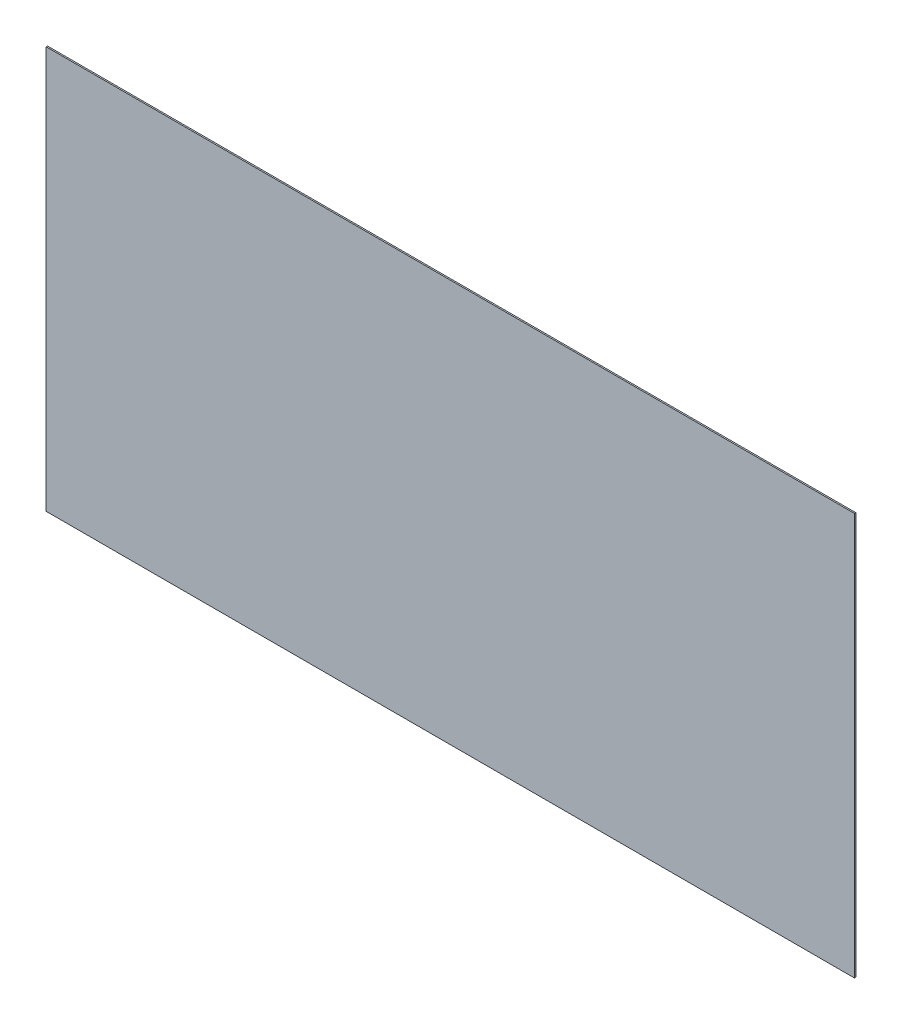
ISO-10303-21;
HEADER;
FILE_DESCRIPTION(('STEP AP214'),'2;1');
FILE_NAME('part.step','',(''),(''),'','','');
FILE_SCHEMA(('AUTOMOTIVE_DESIGN { 1 0 10303 214 1 1 1 1 }'));
ENDSEC;
DATA;
#1=APPLICATION_CONTEXT('core data for automotive mechanical design processes');
#2=APPLICATION_PROTOCOL_DEFINITION('international standard','automotive_design',2000,#1);
#3=PRODUCT_CONTEXT('',#1,'mechanical');
#4=PRODUCT('Part','Part','',(#3));
#5=PRODUCT_RELATED_PRODUCT_CATEGORY('part','',(#4));
#6=PRODUCT_DEFINITION_FORMATION('','',#4);
#7=PRODUCT_DEFINITION_CONTEXT('part definition',#1,'design');
#8=PRODUCT_DEFINITION('design','',#6,#7);
#9=PRODUCT_DEFINITION_SHAPE('','',#8);
#10=(LENGTH_UNIT() NAMED_UNIT(*) SI_UNIT(.MILLI.,.METRE.));
#11=(NAMED_UNIT(*) PLANE_ANGLE_UNIT() SI_UNIT($,.RADIAN.));
#12=(NAMED_UNIT(*) SI_UNIT($,.STERADIAN.) SOLID_ANGLE_UNIT());
#13=UNCERTAINTY_MEASURE_WITH_UNIT(LENGTH_MEASURE(1.E-05),#10,'distance_accuracy_value','');
#14=(GEOMETRIC_REPRESENTATION_CONTEXT(3) GLOBAL_UNCERTAINTY_ASSIGNED_CONTEXT((#13)) GLOBAL_UNIT_ASSIGNED_CONTEXT((#10,
#11,#12)) REPRESENTATION_CONTEXT('',''));
#15=CARTESIAN_POINT('',(0.,0.,0.));
#16=DIRECTION('',(0.,0.,1.));
#17=DIRECTION('',(1.,0.,0.));
#18=AXIS2_PLACEMENT_3D('',#15,#16,#17);
#19=CARTESIAN_POINT('',(13.7,4.,-700.));
#20=DIRECTION('',(-1.,0.,0.));
#21=DIRECTION('',(0.,0.,1.));
#22=AXIS2_PLACEMENT_3D('',#19,#20,#21);
#23=PLANE('',#22);
#24=DIRECTION('',(0.,-1.,0.));
#25=VECTOR('',#24,1.);
#26=CARTESIAN_POINT('',(13.7,4.,-699.));
#27=LINE('',#26,#25);
#28=CARTESIAN_POINT('',(13.7,298.,-699.));
#29=VERTEX_POINT('',#28);
#30=CARTESIAN_POINT('',(13.7,4.,-699.));
#31=VERTEX_POINT('',#30);
#32=EDGE_CURVE('E103',#29,#31,#27,.T.);
#33=ORIENTED_EDGE('',*,*,#32,.F.);
#34=DIRECTION('',(0.,0.,1.));
#35=VECTOR('',#34,1.);
#36=CARTESIAN_POINT('',(13.7,298.,-700.));
#37=LINE('',#36,#35);
#38=CARTESIAN_POINT('',(13.7,298.,-700.));
#39=VERTEX_POINT('',#38);
#40=EDGE_CURVE('E11',#39,#29,#37,.T.);
#41=ORIENTED_EDGE('',*,*,#40,.F.);
#42=DIRECTION('',(0.,-1.,0.));
#43=VECTOR('',#42,1.);
#44=CARTESIAN_POINT('',(13.7,4.,-700.));
#45=LINE('',#44,#43);
#46=CARTESIAN_POINT('',(13.7,4.,-700.));
#47=VERTEX_POINT('',#46);
#48=EDGE_CURVE('E97',#39,#47,#45,.T.);
#49=ORIENTED_EDGE('',*,*,#48,.T.);
#50=DIRECTION('',(0.,0.,1.));
#51=VECTOR('',#50,1.);
#52=CARTESIAN_POINT('',(13.7,4.,-700.));
#53=LINE('',#52,#51);
#54=EDGE_CURVE('E42',#47,#31,#53,.T.);
#55=ORIENTED_EDGE('',*,*,#54,.T.);
#56=EDGE_LOOP('',(#33,#41,#49,#55));
#57=FACE_BOUND('',#56,.T.);
#58=ADVANCED_FACE('F39',(#57),#23,.T.);
#59=CARTESIAN_POINT('',(13.7,298.,-700.));
#60=DIRECTION('',(0.,1.,0.));
#61=DIRECTION('',(0.,0.,1.));
#62=AXIS2_PLACEMENT_3D('',#59,#60,#61);
#63=PLANE('',#62);
#64=DIRECTION('',(-1.,0.,0.));
#65=VECTOR('',#64,1.);
#66=CARTESIAN_POINT('',(13.7,298.,-699.));
#67=LINE('',#66,#65);
#68=CARTESIAN_POINT('',(604.3,298.,-699.));
#69=VERTEX_POINT('',#68);
#70=EDGE_CURVE('E99',#69,#29,#67,.T.);
#71=ORIENTED_EDGE('',*,*,#70,.F.);
#72=DIRECTION('',(0.,0.,1.));
#73=VECTOR('',#72,1.);
#74=CARTESIAN_POINT('',(604.3,298.,-700.));
#75=LINE('',#74,#73);
#76=CARTESIAN_POINT('',(604.3,298.,-700.));
#77=VERTEX_POINT('',#76);
#78=EDGE_CURVE('E48',#77,#69,#75,.T.);
#79=ORIENTED_EDGE('',*,*,#78,.F.);
#80=DIRECTION('',(-1.,0.,0.));
#81=VECTOR('',#80,1.);
#82=CARTESIAN_POINT('',(13.7,298.,-700.));
#83=LINE('',#82,#81);
#84=EDGE_CURVE('E94',#77,#39,#83,.T.);
#85=ORIENTED_EDGE('',*,*,#84,.T.);
#86=ORIENTED_EDGE('',*,*,#40,.T.);
#87=EDGE_LOOP('',(#71,#79,#85,#86));
#88=FACE_BOUND('',#87,.T.);
#89=ADVANCED_FACE('F113',(#88),#63,.T.);
#90=CARTESIAN_POINT('',(604.3,4.,-700.));
#91=DIRECTION('',(1.,0.,0.));
#92=DIRECTION('',(0.,0.,-1.));
#93=AXIS2_PLACEMENT_3D('',#90,#91,#92);
#94=PLANE('',#93);
#95=DIRECTION('',(0.,1.,0.));
#96=VECTOR('',#95,1.);
#97=CARTESIAN_POINT('',(604.3,4.,-699.));
#98=LINE('',#97,#96);
#99=CARTESIAN_POINT('',(604.3,4.,-699.));
#100=VERTEX_POINT('',#99);
#101=EDGE_CURVE('E89',#100,#69,#98,.T.);
#102=ORIENTED_EDGE('',*,*,#101,.F.);
#103=DIRECTION('',(0.,0.,1.));
#104=VECTOR('',#103,1.);
#105=CARTESIAN_POINT('',(604.3,4.,-700.));
#106=LINE('',#105,#104);
#107=CARTESIAN_POINT('',(604.3,4.,-700.));
#108=VERTEX_POINT('',#107);
#109=EDGE_CURVE('E84',#108,#100,#106,.T.);
#110=ORIENTED_EDGE('',*,*,#109,.F.);
#111=DIRECTION('',(0.,1.,0.));
#112=VECTOR('',#111,1.);
#113=CARTESIAN_POINT('',(604.3,4.,-700.));
#114=LINE('',#113,#112);
#115=EDGE_CURVE('E87',#108,#77,#114,.T.);
#116=ORIENTED_EDGE('',*,*,#115,.T.);
#117=ORIENTED_EDGE('',*,*,#78,.T.);
#118=EDGE_LOOP('',(#102,#110,#116,#117));
#119=FACE_BOUND('',#118,.T.);
#120=ADVANCED_FACE('F86',(#119),#94,.T.);
#121=CARTESIAN_POINT('',(13.7,4.,-700.));
#122=DIRECTION('',(0.,-1.,0.));
#123=DIRECTION('',(0.,0.,-1.));
#124=AXIS2_PLACEMENT_3D('',#121,#122,#123);
#125=PLANE('',#124);
#126=DIRECTION('',(1.,0.,0.));
#127=VECTOR('',#126,1.);
#128=CARTESIAN_POINT('',(13.7,4.,-699.));
#129=LINE('',#128,#127);
#130=EDGE_CURVE('E106',#31,#100,#129,.T.);
#131=ORIENTED_EDGE('',*,*,#130,.F.);
#132=ORIENTED_EDGE('',*,*,#54,.F.);
#133=DIRECTION('',(1.,0.,0.));
#134=VECTOR('',#133,1.);
#135=CARTESIAN_POINT('',(13.7,4.,-700.));
#136=LINE('',#135,#134);
#137=EDGE_CURVE('E93',#47,#108,#136,.T.);
#138=ORIENTED_EDGE('',*,*,#137,.T.);
#139=ORIENTED_EDGE('',*,*,#109,.T.);
#140=EDGE_LOOP('',(#131,#132,#138,#139));
#141=FACE_BOUND('',#140,.T.);
#142=ADVANCED_FACE('F96',(#141),#125,.T.);
#143=CARTESIAN_POINT('',(0.,0.,-700.));
#144=DIRECTION('',(0.,0.,-1.));
#145=DIRECTION('',(-1.,0.,0.));
#146=AXIS2_PLACEMENT_3D('',#143,#144,#145);
#147=PLANE('',#146);
#148=ORIENTED_EDGE('',*,*,#48,.F.);
#149=ORIENTED_EDGE('',*,*,#84,.F.);
#150=ORIENTED_EDGE('',*,*,#115,.F.);
#151=ORIENTED_EDGE('',*,*,#137,.F.);
#152=EDGE_LOOP('',(#148,#149,#150,#151));
#153=FACE_BOUND('',#152,.T.);
#154=ADVANCED_FACE('F92',(#153),#147,.T.);
#155=CARTESIAN_POINT('',(0.,0.,-699.));
#156=DIRECTION('',(0.,0.,-1.));
#157=DIRECTION('',(-1.,0.,0.));
#158=AXIS2_PLACEMENT_3D('',#155,#156,#157);
#159=PLANE('',#158);
#160=ORIENTED_EDGE('',*,*,#32,.T.);
#161=ORIENTED_EDGE('',*,*,#130,.T.);
#162=ORIENTED_EDGE('',*,*,#101,.T.);
#163=ORIENTED_EDGE('',*,*,#70,.T.);
#164=EDGE_LOOP('',(#160,#161,#162,#163));
#165=FACE_BOUND('',#164,.T.);
#166=ADVANCED_FACE('F112',(#165),#159,.F.);
#167=CLOSED_SHELL('',(#58,#89,#120,#142,#154,#166));
#168=MANIFOLD_SOLID_BREP('B2',#167);
#169=ADVANCED_BREP_SHAPE_REPRESENTATION('',(#18,#168),#14);
#170=SHAPE_DEFINITION_REPRESENTATION(#9,#169);
ENDSEC;
END-ISO-10303-21;
